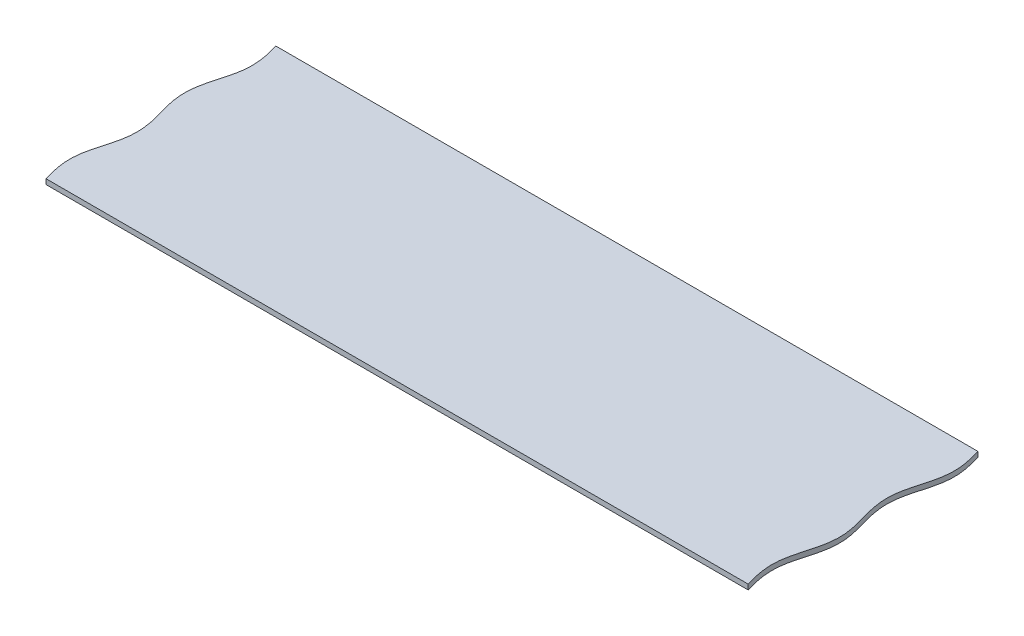
ISO-10303-21;
HEADER;
FILE_DESCRIPTION(('STEP AP214'),'2;1');
FILE_NAME('part.step','',(''),(''),'','','');
FILE_SCHEMA(('AUTOMOTIVE_DESIGN { 1 0 10303 214 1 1 1 1 }'));
ENDSEC;
DATA;
#1=APPLICATION_CONTEXT('core data for automotive mechanical design processes');
#2=APPLICATION_PROTOCOL_DEFINITION('international standard','automotive_design',2000,#1);
#3=PRODUCT_CONTEXT('',#1,'mechanical');
#4=PRODUCT('Part','Part','',(#3));
#5=PRODUCT_RELATED_PRODUCT_CATEGORY('part','',(#4));
#6=PRODUCT_DEFINITION_FORMATION('','',#4);
#7=PRODUCT_DEFINITION_CONTEXT('part definition',#1,'design');
#8=PRODUCT_DEFINITION('design','',#6,#7);
#9=PRODUCT_DEFINITION_SHAPE('','',#8);
#10=(LENGTH_UNIT() NAMED_UNIT(*) SI_UNIT(.MILLI.,.METRE.));
#11=(NAMED_UNIT(*) PLANE_ANGLE_UNIT() SI_UNIT($,.RADIAN.));
#12=(NAMED_UNIT(*) SI_UNIT($,.STERADIAN.) SOLID_ANGLE_UNIT());
#13=UNCERTAINTY_MEASURE_WITH_UNIT(LENGTH_MEASURE(1.E-05),#10,'distance_accuracy_value','');
#14=(GEOMETRIC_REPRESENTATION_CONTEXT(3) GLOBAL_UNCERTAINTY_ASSIGNED_CONTEXT((#13)) GLOBAL_UNIT_ASSIGNED_CONTEXT((#10,
#11,#12)) REPRESENTATION_CONTEXT('',''));
#15=CARTESIAN_POINT('',(0.,0.,0.));
#16=DIRECTION('',(0.,0.,1.));
#17=DIRECTION('',(1.,0.,0.));
#18=AXIS2_PLACEMENT_3D('',#15,#16,#17);
#19=CARTESIAN_POINT('',(-6.95806259831677E-09,0.4,-2.49163584323297E-08));
#20=CARTESIAN_POINT('',(0.0332622537159556,0.4,0.119109920097542));
#21=CARTESIAN_POINT('',(0.0829915405982185,0.4,0.297189427365221));
#22=CARTESIAN_POINT('',(0.189772351136532,0.4,0.690951549649171));
#23=CARTESIAN_POINT('',(0.257898590632143,0.4,0.997698602409381));
#24=CARTESIAN_POINT('',(0.325744815648045,0.4,1.33634589732345));
#25=CARTESIAN_POINT('',(0.368877768101951,0.4,1.64893884440532));
#26=CARTESIAN_POINT('',(0.398888985668583,0.4,1.99446871524222));
#27=CARTESIAN_POINT('',(0.40387539327897,0.4,2.33110595374861));
#28=CARTESIAN_POINT('',(0.387597754650795,0.4,2.67239706116513));
#29=CARTESIAN_POINT('',(0.344466555206628,0.4,3.05124475563772));
#30=CARTESIAN_POINT('',(0.269643322126312,0.4,3.46931162759609));
#31=CARTESIAN_POINT('',(0.151200158163862,0.4,3.9641852608322));
#32=CARTESIAN_POINT('',(-0.00959826587143607,0.4,4.53602852401604));
#33=CARTESIAN_POINT('',(-0.182858501986536,0.4,5.15072772547256));
#34=CARTESIAN_POINT('',(-0.332476973876635,0.4,5.81633560812181));
#35=CARTESIAN_POINT('',(-0.412419892566256,0.4,6.49502826089269));
#36=CARTESIAN_POINT('',(-0.399611137650372,0.4,7.22312313237757));
#37=CARTESIAN_POINT('',(-0.257869581308873,0.4,8.10865448638783));
#38=CARTESIAN_POINT('',(0.00245048128050707,0.4,9.00787392102832));
#39=CARTESIAN_POINT('',(0.261734400621338,0.4,9.90745905620298));
#40=CARTESIAN_POINT('',(0.401315474945269,0.4,10.7905213385431));
#41=CARTESIAN_POINT('',(0.4129363469469,0.4,11.5138994591447));
#42=CARTESIAN_POINT('',(0.332704186438562,0.4,12.1901449100557));
#43=CARTESIAN_POINT('',(0.183645521873159,0.4,12.8530434725281));
#44=CARTESIAN_POINT('',(0.0111999100878558,0.4,13.465115176017));
#45=CARTESIAN_POINT('',(-0.14942949266156,0.4,14.0361864925598));
#46=CARTESIAN_POINT('',(-0.267954844806281,0.4,14.5306344702978));
#47=CARTESIAN_POINT('',(-0.342991481190055,0.4,14.9486616922745));
#48=CARTESIAN_POINT('',(-0.386359925103216,0.4,15.3274819051532));
#49=CARTESIAN_POINT('',(-0.402868830190941,0.4,15.6687612164247));
#50=CARTESIAN_POINT('',(-0.39811837623623,0.4,16.0054027160032));
#51=CARTESIAN_POINT('',(-0.368329950179447,0.4,16.3509511235371));
#52=CARTESIAN_POINT('',(-0.325385601822208,0.4,16.6635723699091));
#53=CARTESIAN_POINT('',(-0.257688326719345,0.4,17.0022477218368));
#54=CARTESIAN_POINT('',(-0.189695541749666,0.4,17.3090289855722));
#55=CARTESIAN_POINT('',(-0.0829742754412816,0.4,17.7028040359142));
#56=CARTESIAN_POINT('',(-0.0332621743081475,0.4,17.8808900296271));
#57=CARTESIAN_POINT('',(0.,0.4,18.));
#58=B_SPLINE_CURVE_WITH_KNOTS('',4,(#19,#20,#21,#22,#23,#24,#25,#26,#27,#28,#29,#30,#31,#32,#33,
#34,#35,#36,#37,#38,#39,#40,#41,#42,#43,#44,#45,#46,#47,#48,#49,#50,#51,#52,#53,#54,#55,#56,
#57),.UNSPECIFIED.,.F.,.F.,(5,1,1,1,1,1,1,1,1,1,1,1,1,1,1,1,1,1,1,1,1,1,1,1,1,1,1,1,1,1,1,1,1,1,
1,5),(0.08295493387815,0.109918584293645,0.123400410206203,0.13688223611876,0.152330914395045,
0.16777959267133,0.183228217188308,0.198676841705286,0.214125487707843,0.229574133710401,
0.252675636877742,0.275777140045082,0.306674482740597,0.337571825436111,0.36882683249437,
0.399724072723889,0.430621367213292,0.469600647416376,0.531395370139949,0.569874019865951,
0.600771290800255,0.631668595224938,0.662565916015931,0.693391747073864,0.724217578131796,
0.747319081453467,0.770420584775138,0.785869231036214,0.801317877297289,0.816766501632596,
0.832215125967904,0.847663803836407,0.863112481704911,0.876594307749484,0.890076133794058,
0.917039785883205),.UNSPECIFIED.);
#59=DIRECTION('',(0.,-1.,0.));
#60=VECTOR('',#59,1.);
#61=SURFACE_OF_LINEAR_EXTRUSION('',#58,#60);
#62=CARTESIAN_POINT('',(-6.95806259831677E-09,0.,-2.49163584323297E-08));
#63=CARTESIAN_POINT('',(0.0332622537159556,0.,0.119109920097542));
#64=CARTESIAN_POINT('',(0.0829915405982185,0.,0.297189427365221));
#65=CARTESIAN_POINT('',(0.189772351136532,0.,0.690951549649171));
#66=CARTESIAN_POINT('',(0.257898590632143,0.,0.997698602409381));
#67=CARTESIAN_POINT('',(0.325744815648045,0.,1.33634589732345));
#68=CARTESIAN_POINT('',(0.368877768101951,0.,1.64893884440532));
#69=CARTESIAN_POINT('',(0.398888985668583,0.,1.99446871524222));
#70=CARTESIAN_POINT('',(0.40387539327897,0.,2.33110595374861));
#71=CARTESIAN_POINT('',(0.387597754650795,0.,2.67239706116513));
#72=CARTESIAN_POINT('',(0.344466555206628,0.,3.05124475563772));
#73=CARTESIAN_POINT('',(0.269643322126312,0.,3.46931162759609));
#74=CARTESIAN_POINT('',(0.151200158163862,0.,3.9641852608322));
#75=CARTESIAN_POINT('',(-0.00959826587143607,0.,4.53602852401604));
#76=CARTESIAN_POINT('',(-0.182858501986536,0.,5.15072772547256));
#77=CARTESIAN_POINT('',(-0.332476973876635,0.,5.81633560812181));
#78=CARTESIAN_POINT('',(-0.412419892566256,0.,6.49502826089269));
#79=CARTESIAN_POINT('',(-0.399611137650372,0.,7.22312313237757));
#80=CARTESIAN_POINT('',(-0.257869581308873,0.,8.10865448638783));
#81=CARTESIAN_POINT('',(0.00245048128050707,0.,9.00787392102832));
#82=CARTESIAN_POINT('',(0.261734400621338,0.,9.90745905620298));
#83=CARTESIAN_POINT('',(0.401315474945269,0.,10.7905213385431));
#84=CARTESIAN_POINT('',(0.4129363469469,0.,11.5138994591447));
#85=CARTESIAN_POINT('',(0.332704186438562,0.,12.1901449100557));
#86=CARTESIAN_POINT('',(0.183645521873159,0.,12.8530434725281));
#87=CARTESIAN_POINT('',(0.0111999100878558,0.,13.465115176017));
#88=CARTESIAN_POINT('',(-0.14942949266156,0.,14.0361864925598));
#89=CARTESIAN_POINT('',(-0.267954844806281,0.,14.5306344702978));
#90=CARTESIAN_POINT('',(-0.342991481190055,0.,14.9486616922745));
#91=CARTESIAN_POINT('',(-0.386359925103216,0.,15.3274819051532));
#92=CARTESIAN_POINT('',(-0.402868830190941,0.,15.6687612164247));
#93=CARTESIAN_POINT('',(-0.39811837623623,0.,16.0054027160032));
#94=CARTESIAN_POINT('',(-0.368329950179447,0.,16.3509511235371));
#95=CARTESIAN_POINT('',(-0.325385601822208,0.,16.6635723699091));
#96=CARTESIAN_POINT('',(-0.257688326719345,0.,17.0022477218368));
#97=CARTESIAN_POINT('',(-0.189695541749666,0.,17.3090289855722));
#98=CARTESIAN_POINT('',(-0.0829742754412816,0.,17.7028040359142));
#99=CARTESIAN_POINT('',(-0.0332621743081475,0.,17.8808900296271));
#100=CARTESIAN_POINT('',(0.,0.,18.));
#101=B_SPLINE_CURVE_WITH_KNOTS('',4,(#62,#63,#64,#65,#66,#67,#68,#69,#70,#71,#72,#73,#74,#75,
#76,#77,#78,#79,#80,#81,#82,#83,#84,#85,#86,#87,#88,#89,#90,#91,#92,#93,#94,#95,#96,#97,#98,#99,
#100),.UNSPECIFIED.,.F.,.F.,(5,1,1,1,1,1,1,1,1,1,1,1,1,1,1,1,1,1,1,1,1,1,1,1,1,1,1,1,1,1,1,1,1,
1,1,5),(0.08295493387815,0.109918584293645,0.123400410206203,0.13688223611876,0.152330914395045,
0.16777959267133,0.183228217188308,0.198676841705286,0.214125487707843,0.229574133710401,
0.252675636877742,0.275777140045082,0.306674482740597,0.337571825436111,0.36882683249437,
0.399724072723889,0.430621367213292,0.469600647416376,0.531395370139949,0.569874019865951,
0.600771290800255,0.631668595224938,0.662565916015931,0.693391747073864,0.724217578131796,
0.747319081453467,0.770420584775138,0.785869231036214,0.801317877297289,0.816766501632596,
0.832215125967904,0.847663803836407,0.863112481704911,0.876594307749484,0.890076133794058,
0.917039785883205),.UNSPECIFIED.);
#102=CARTESIAN_POINT('',(0.,0.,0.));
#103=VERTEX_POINT('',#102);
#104=CARTESIAN_POINT('',(0.,0.,18.));
#105=VERTEX_POINT('',#104);
#106=EDGE_CURVE('E122',#103,#105,#101,.T.);
#107=ORIENTED_EDGE('',*,*,#106,.T.);
#108=DIRECTION('',(0.,-1.,0.));
#109=VECTOR('',#108,1.);
#110=CARTESIAN_POINT('',(0.,0.4,18.));
#111=LINE('',#110,#109);
#112=CARTESIAN_POINT('',(0.,0.4,18.));
#113=VERTEX_POINT('',#112);
#114=EDGE_CURVE('E11',#113,#105,#111,.T.);
#115=ORIENTED_EDGE('',*,*,#114,.F.);
#116=CARTESIAN_POINT('',(0.,0.4,0.));
#117=VERTEX_POINT('',#116);
#118=EDGE_CURVE('E91',#117,#113,#58,.T.);
#119=ORIENTED_EDGE('',*,*,#118,.F.);
#120=DIRECTION('',(0.,-1.,0.));
#121=VECTOR('',#120,1.);
#122=CARTESIAN_POINT('',(0.,0.4,0.));
#123=LINE('',#122,#121);
#124=EDGE_CURVE('E99',#117,#103,#123,.T.);
#125=ORIENTED_EDGE('',*,*,#124,.T.);
#126=EDGE_LOOP('',(#107,#115,#119,#125));
#127=FACE_BOUND('',#126,.T.);
#128=ADVANCED_FACE('F39',(#127),#61,.F.);
#129=CARTESIAN_POINT('',(55.,0.4,18.));
#130=DIRECTION('',(0.,0.,-1.));
#131=DIRECTION('',(-1.,0.,0.));
#132=AXIS2_PLACEMENT_3D('',#129,#130,#131);
#133=PLANE('',#132);
#134=DIRECTION('',(1.,0.,0.));
#135=VECTOR('',#134,1.);
#136=CARTESIAN_POINT('',(55.,0.,18.));
#137=LINE('',#136,#135);
#138=CARTESIAN_POINT('',(55.,0.,18.));
#139=VERTEX_POINT('',#138);
#140=EDGE_CURVE('E95',#105,#139,#137,.T.);
#141=ORIENTED_EDGE('',*,*,#140,.T.);
#142=DIRECTION('',(0.,-1.,0.));
#143=VECTOR('',#142,1.);
#144=CARTESIAN_POINT('',(55.,0.4,18.));
#145=LINE('',#144,#143);
#146=CARTESIAN_POINT('',(55.,0.4,18.));
#147=VERTEX_POINT('',#146);
#148=EDGE_CURVE('E48',#147,#139,#145,.T.);
#149=ORIENTED_EDGE('',*,*,#148,.F.);
#150=DIRECTION('',(1.,0.,0.));
#151=VECTOR('',#150,1.);
#152=CARTESIAN_POINT('',(55.,0.4,18.));
#153=LINE('',#152,#151);
#154=EDGE_CURVE('E86',#113,#147,#153,.T.);
#155=ORIENTED_EDGE('',*,*,#154,.F.);
#156=ORIENTED_EDGE('',*,*,#114,.T.);
#157=EDGE_LOOP('',(#141,#149,#155,#156));
#158=FACE_BOUND('',#157,.T.);
#159=ADVANCED_FACE('F94',(#158),#133,.F.);
#160=CARTESIAN_POINT('',(55.,0.4,18.));
#161=CARTESIAN_POINT('',(54.9667378256918,0.4,17.8808900296271));
#162=CARTESIAN_POINT('',(54.9170257245587,0.4,17.7028040359143));
#163=CARTESIAN_POINT('',(54.8103044582503,0.4,17.3090289855724));
#164=CARTESIAN_POINT('',(54.7423116732807,0.4,17.0022477218369));
#165=CARTESIAN_POINT('',(54.674614398178,0.4,16.6635723699092));
#166=CARTESIAN_POINT('',(54.6316700498206,0.4,16.3509511235373));
#167=CARTESIAN_POINT('',(54.6018816237637,0.4,16.0054027160034));
#168=CARTESIAN_POINT('',(54.5971311698092,0.4,15.6687612164249));
#169=CARTESIAN_POINT('',(54.6136400748969,0.4,15.3274819051534));
#170=CARTESIAN_POINT('',(54.6570085188101,0.4,14.9486616922746));
#171=CARTESIAN_POINT('',(54.7320451551939,0.4,14.530634470298));
#172=CARTESIAN_POINT('',(54.8505705073386,0.4,14.0361864925599));
#173=CARTESIAN_POINT('',(55.011199910088,0.4,13.4651151760172));
#174=CARTESIAN_POINT('',(55.1836455218732,0.4,12.8530434725282));
#175=CARTESIAN_POINT('',(55.3327041864387,0.4,12.1901449100558));
#176=CARTESIAN_POINT('',(55.412936346947,0.4,11.5138994591448));
#177=CARTESIAN_POINT('',(55.4013154749452,0.4,10.7905213385431));
#178=CARTESIAN_POINT('',(55.2617344006212,0.4,9.90745905620306));
#179=CARTESIAN_POINT('',(55.0024504812806,0.4,9.00787392102835));
#180=CARTESIAN_POINT('',(54.7421304186912,0.4,8.1086544863879));
#181=CARTESIAN_POINT('',(54.6003888623497,0.4,7.22312313237761));
#182=CARTESIAN_POINT('',(54.5875801074339,0.4,6.49502826089276));
#183=CARTESIAN_POINT('',(54.6675230261233,0.4,5.81633560812184));
#184=CARTESIAN_POINT('',(54.8171414980135,0.4,5.15072772547259));
#185=CARTESIAN_POINT('',(54.9904017341286,0.4,4.53602852401606));
#186=CARTESIAN_POINT('',(55.1512001581639,0.4,3.96418526083218));
#187=CARTESIAN_POINT('',(55.2696433221263,0.4,3.46931162759613));
#188=CARTESIAN_POINT('',(55.3444665552067,0.4,3.05124475563775));
#189=CARTESIAN_POINT('',(55.3875977546508,0.4,2.67239706116515));
#190=CARTESIAN_POINT('',(55.4038753932788,0.4,2.33110595374862));
#191=CARTESIAN_POINT('',(55.3988889856687,0.4,1.99446871524224));
#192=CARTESIAN_POINT('',(55.368877768102,0.4,1.64893884440533));
#193=CARTESIAN_POINT('',(55.3257448156481,0.4,1.33634589732345));
#194=CARTESIAN_POINT('',(55.2578985906322,0.4,0.997698602409378));
#195=CARTESIAN_POINT('',(55.1897723511366,0.4,0.690951549649173));
#196=CARTESIAN_POINT('',(55.0829915405983,0.4,0.297189427365216));
#197=CARTESIAN_POINT('',(55.033262253716,0.4,0.119109920097533));
#198=CARTESIAN_POINT('',(54.9999999930419,0.4,-2.4916369470863E-08));
#199=B_SPLINE_CURVE_WITH_KNOTS('',4,(#160,#161,#162,#163,#164,#165,#166,#167,#168,#169,#170,
#171,#172,#173,#174,#175,#176,#177,#178,#179,#180,#181,#182,#183,#184,#185,#186,#187,#188,#189,
#190,#191,#192,#193,#194,#195,#196,#197,#198),.UNSPECIFIED.,.F.,.F.,(5,1,1,1,1,1,1,1,1,1,1,1,1,
1,1,1,1,1,1,1,1,1,1,1,1,1,1,1,1,1,1,1,1,1,1,5),(0.0829549338781504,0.109918585967297,
0.12340041201187,0.136882238056444,0.152330915924948,0.167779593793451,0.183228218128759,
0.198676842464066,0.214125488725141,0.229574134986217,0.252675638307888,0.275777141629559,
0.306602972687491,0.337428803745424,0.368326124536417,0.3992234289611,0.430120699895404,
0.468599349621406,0.530394072344979,0.569373352548063,0.600270647037466,0.631167887266985,
0.662422894325243,0.693320237020758,0.724217579716273,0.747319082883613,0.770420586050954,
0.785869232053512,0.801317878056069,0.816766502573047,0.832215127090025,0.84766380536631,
0.863112483642595,0.876594309555152,0.890076135467709,0.917039785883205),.UNSPECIFIED.);
#200=DIRECTION('',(0.,-1.,0.));
#201=VECTOR('',#200,1.);
#202=SURFACE_OF_LINEAR_EXTRUSION('',#199,#201);
#203=CARTESIAN_POINT('',(55.,0.,18.));
#204=CARTESIAN_POINT('',(54.9667378256918,0.,17.8808900296271));
#205=CARTESIAN_POINT('',(54.9170257245587,0.,17.7028040359143));
#206=CARTESIAN_POINT('',(54.8103044582503,0.,17.3090289855724));
#207=CARTESIAN_POINT('',(54.7423116732807,0.,17.0022477218369));
#208=CARTESIAN_POINT('',(54.674614398178,0.,16.6635723699092));
#209=CARTESIAN_POINT('',(54.6316700498206,0.,16.3509511235373));
#210=CARTESIAN_POINT('',(54.6018816237637,0.,16.0054027160034));
#211=CARTESIAN_POINT('',(54.5971311698092,0.,15.6687612164249));
#212=CARTESIAN_POINT('',(54.6136400748969,0.,15.3274819051534));
#213=CARTESIAN_POINT('',(54.6570085188101,0.,14.9486616922746));
#214=CARTESIAN_POINT('',(54.7320451551939,0.,14.530634470298));
#215=CARTESIAN_POINT('',(54.8505705073386,0.,14.0361864925599));
#216=CARTESIAN_POINT('',(55.011199910088,0.,13.4651151760172));
#217=CARTESIAN_POINT('',(55.1836455218732,0.,12.8530434725282));
#218=CARTESIAN_POINT('',(55.3327041864387,0.,12.1901449100558));
#219=CARTESIAN_POINT('',(55.412936346947,0.,11.5138994591448));
#220=CARTESIAN_POINT('',(55.4013154749452,0.,10.7905213385431));
#221=CARTESIAN_POINT('',(55.2617344006212,0.,9.90745905620306));
#222=CARTESIAN_POINT('',(55.0024504812806,0.,9.00787392102835));
#223=CARTESIAN_POINT('',(54.7421304186912,0.,8.1086544863879));
#224=CARTESIAN_POINT('',(54.6003888623497,0.,7.22312313237761));
#225=CARTESIAN_POINT('',(54.5875801074339,0.,6.49502826089276));
#226=CARTESIAN_POINT('',(54.6675230261233,0.,5.81633560812184));
#227=CARTESIAN_POINT('',(54.8171414980135,0.,5.15072772547259));
#228=CARTESIAN_POINT('',(54.9904017341286,0.,4.53602852401606));
#229=CARTESIAN_POINT('',(55.1512001581639,0.,3.96418526083218));
#230=CARTESIAN_POINT('',(55.2696433221263,0.,3.46931162759613));
#231=CARTESIAN_POINT('',(55.3444665552067,0.,3.05124475563775));
#232=CARTESIAN_POINT('',(55.3875977546508,0.,2.67239706116515));
#233=CARTESIAN_POINT('',(55.4038753932788,0.,2.33110595374862));
#234=CARTESIAN_POINT('',(55.3988889856687,0.,1.99446871524224));
#235=CARTESIAN_POINT('',(55.368877768102,0.,1.64893884440533));
#236=CARTESIAN_POINT('',(55.3257448156481,0.,1.33634589732345));
#237=CARTESIAN_POINT('',(55.2578985906322,0.,0.997698602409378));
#238=CARTESIAN_POINT('',(55.1897723511366,0.,0.690951549649173));
#239=CARTESIAN_POINT('',(55.0829915405983,0.,0.297189427365216));
#240=CARTESIAN_POINT('',(55.033262253716,0.,0.119109920097533));
#241=CARTESIAN_POINT('',(54.9999999930419,0.,-2.4916369470863E-08));
#242=B_SPLINE_CURVE_WITH_KNOTS('',4,(#203,#204,#205,#206,#207,#208,#209,#210,#211,#212,#213,
#214,#215,#216,#217,#218,#219,#220,#221,#222,#223,#224,#225,#226,#227,#228,#229,#230,#231,#232,
#233,#234,#235,#236,#237,#238,#239,#240,#241),.UNSPECIFIED.,.F.,.F.,(5,1,1,1,1,1,1,1,1,1,1,1,1,
1,1,1,1,1,1,1,1,1,1,1,1,1,1,1,1,1,1,1,1,1,1,5),(0.0829549338781504,0.109918585967297,
0.12340041201187,0.136882238056444,0.152330915924948,0.167779593793451,0.183228218128759,
0.198676842464066,0.214125488725141,0.229574134986217,0.252675638307888,0.275777141629559,
0.306602972687491,0.337428803745424,0.368326124536417,0.3992234289611,0.430120699895404,
0.468599349621406,0.530394072344979,0.569373352548063,0.600270647037466,0.631167887266985,
0.662422894325243,0.693320237020758,0.724217579716273,0.747319082883613,0.770420586050954,
0.785869232053512,0.801317878056069,0.816766502573047,0.832215127090025,0.84766380536631,
0.863112483642595,0.876594309555152,0.890076135467709,0.917039785883205),.UNSPECIFIED.);
#243=CARTESIAN_POINT('',(55.,0.,0.));
#244=VERTEX_POINT('',#243);
#245=EDGE_CURVE('E73',#139,#244,#242,.T.);
#246=ORIENTED_EDGE('',*,*,#245,.T.);
#247=DIRECTION('',(0.,-1.,0.));
#248=VECTOR('',#247,1.);
#249=CARTESIAN_POINT('',(55.,0.4,0.));
#250=LINE('',#249,#248);
#251=CARTESIAN_POINT('',(55.,0.4,0.));
#252=VERTEX_POINT('',#251);
#253=EDGE_CURVE('E96',#252,#244,#250,.T.);
#254=ORIENTED_EDGE('',*,*,#253,.F.);
#255=EDGE_CURVE('E89',#147,#252,#199,.T.);
#256=ORIENTED_EDGE('',*,*,#255,.F.);
#257=ORIENTED_EDGE('',*,*,#148,.T.);
#258=EDGE_LOOP('',(#246,#254,#256,#257));
#259=FACE_BOUND('',#258,.T.);
#260=ADVANCED_FACE('F97',(#259),#202,.F.);
#261=CARTESIAN_POINT('',(0.,0.4,0.));
#262=DIRECTION('',(0.,0.,1.));
#263=DIRECTION('',(1.,0.,0.));
#264=AXIS2_PLACEMENT_3D('',#261,#262,#263);
#265=PLANE('',#264);
#266=DIRECTION('',(-1.,0.,0.));
#267=VECTOR('',#266,1.);
#268=CARTESIAN_POINT('',(0.,0.,0.));
#269=LINE('',#268,#267);
#270=EDGE_CURVE('E79',#244,#103,#269,.T.);
#271=ORIENTED_EDGE('',*,*,#270,.T.);
#272=ORIENTED_EDGE('',*,*,#124,.F.);
#273=DIRECTION('',(-1.,0.,0.));
#274=VECTOR('',#273,1.);
#275=CARTESIAN_POINT('',(0.,0.4,0.));
#276=LINE('',#275,#274);
#277=EDGE_CURVE('E56',#252,#117,#276,.T.);
#278=ORIENTED_EDGE('',*,*,#277,.F.);
#279=ORIENTED_EDGE('',*,*,#253,.T.);
#280=EDGE_LOOP('',(#271,#272,#278,#279));
#281=FACE_BOUND('',#280,.T.);
#282=ADVANCED_FACE('F111',(#281),#265,.F.);
#283=CARTESIAN_POINT('',(2.06897890608074E-07,0.4,8.9999972110335));
#284=DIRECTION('',(0.,1.,0.));
#285=DIRECTION('',(0.,0.,1.));
#286=AXIS2_PLACEMENT_3D('',#283,#284,#285);
#287=PLANE('',#286);
#288=ORIENTED_EDGE('',*,*,#118,.T.);
#289=ORIENTED_EDGE('',*,*,#154,.T.);
#290=ORIENTED_EDGE('',*,*,#255,.T.);
#291=ORIENTED_EDGE('',*,*,#277,.T.);
#292=EDGE_LOOP('',(#288,#289,#290,#291));
#293=FACE_BOUND('',#292,.T.);
#294=ADVANCED_FACE('F87',(#293),#287,.T.);
#295=CARTESIAN_POINT('',(2.06897890608074E-07,0.,8.9999972110335));
#296=DIRECTION('',(0.,1.,0.));
#297=DIRECTION('',(0.,0.,1.));
#298=AXIS2_PLACEMENT_3D('',#295,#296,#297);
#299=PLANE('',#298);
#300=ORIENTED_EDGE('',*,*,#106,.F.);
#301=ORIENTED_EDGE('',*,*,#270,.F.);
#302=ORIENTED_EDGE('',*,*,#245,.F.);
#303=ORIENTED_EDGE('',*,*,#140,.F.);
#304=EDGE_LOOP('',(#300,#301,#302,#303));
#305=FACE_BOUND('',#304,.T.);
#306=ADVANCED_FACE('F139',(#305),#299,.F.);
#307=CLOSED_SHELL('',(#128,#159,#260,#282,#294,#306));
#308=MANIFOLD_SOLID_BREP('B2',#307);
#309=ADVANCED_BREP_SHAPE_REPRESENTATION('',(#18,#308),#14);
#310=SHAPE_DEFINITION_REPRESENTATION(#9,#309);
ENDSEC;
END-ISO-10303-21;
